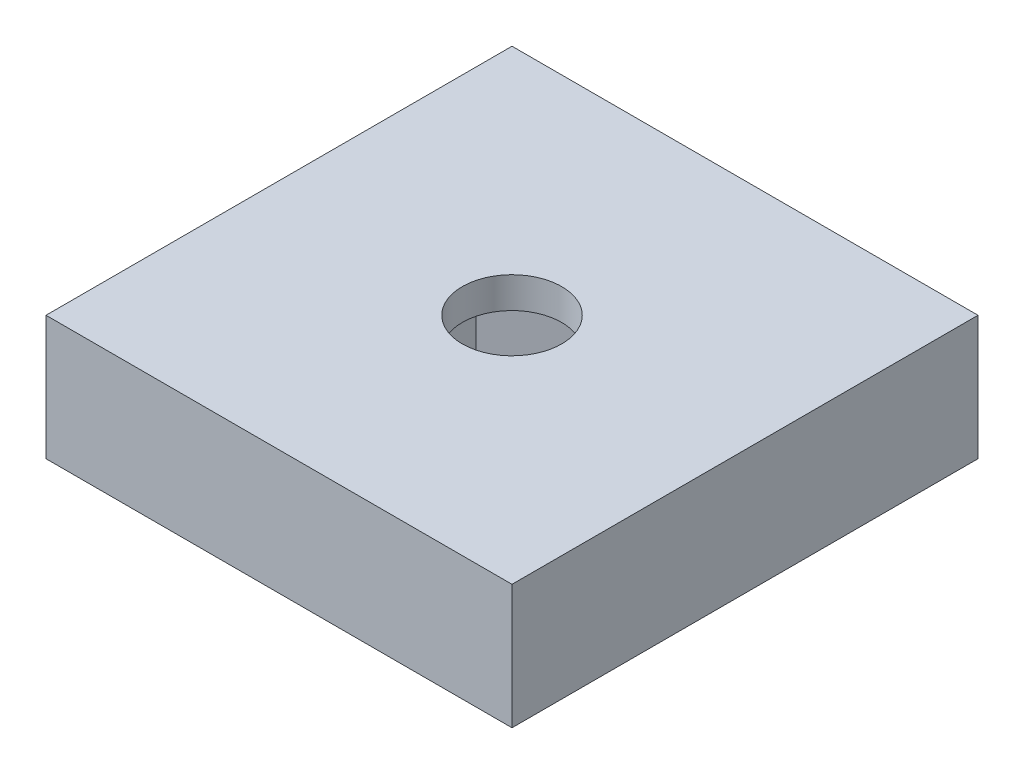
ISO-10303-21;
HEADER;
FILE_DESCRIPTION(('STEP AP214'),'2;1');
FILE_NAME('part.step','',(''),(''),'','','');
FILE_SCHEMA(('AUTOMOTIVE_DESIGN { 1 0 10303 214 1 1 1 1 }'));
ENDSEC;
DATA;
#1=APPLICATION_CONTEXT('core data for automotive mechanical design processes');
#2=APPLICATION_PROTOCOL_DEFINITION('international standard','automotive_design',2000,#1);
#3=PRODUCT_CONTEXT('',#1,'mechanical');
#4=PRODUCT('Part','Part','',(#3));
#5=PRODUCT_RELATED_PRODUCT_CATEGORY('part','',(#4));
#6=PRODUCT_DEFINITION_FORMATION('','',#4);
#7=PRODUCT_DEFINITION_CONTEXT('part definition',#1,'design');
#8=PRODUCT_DEFINITION('design','',#6,#7);
#9=PRODUCT_DEFINITION_SHAPE('','',#8);
#10=(LENGTH_UNIT() NAMED_UNIT(*) SI_UNIT(.MILLI.,.METRE.));
#11=(NAMED_UNIT(*) PLANE_ANGLE_UNIT() SI_UNIT($,.RADIAN.));
#12=(NAMED_UNIT(*) SI_UNIT($,.STERADIAN.) SOLID_ANGLE_UNIT());
#13=UNCERTAINTY_MEASURE_WITH_UNIT(LENGTH_MEASURE(1.E-05),#10,'distance_accuracy_value','');
#14=(GEOMETRIC_REPRESENTATION_CONTEXT(3) GLOBAL_UNCERTAINTY_ASSIGNED_CONTEXT((#13)) GLOBAL_UNIT_ASSIGNED_CONTEXT((#10,
#11,#12)) REPRESENTATION_CONTEXT('',''));
#15=CARTESIAN_POINT('',(0.,0.,0.));
#16=DIRECTION('',(0.,0.,1.));
#17=DIRECTION('',(1.,0.,0.));
#18=AXIS2_PLACEMENT_3D('',#15,#16,#17);
#19=CARTESIAN_POINT('',(7.5,3.,-7.5));
#20=DIRECTION('',(0.,-1.,0.));
#21=DIRECTION('',(0.,0.,-1.));
#22=AXIS2_PLACEMENT_3D('',#19,#20,#21);
#23=CYLINDRICAL_SURFACE('',#22,1.6);
#24=CARTESIAN_POINT('',(7.5,0.,-7.5));
#25=DIRECTION('',(0.,1.,0.));
#26=DIRECTION('',(0.,0.,1.));
#27=AXIS2_PLACEMENT_3D('',#24,#25,#26);
#28=CIRCLE('',#27,1.6);
#29=CARTESIAN_POINT('',(7.5,0.,-5.9));
#30=VERTEX_POINT('',#29);
#31=EDGE_CURVE('E194',#30,#30,#28,.T.);
#32=ORIENTED_EDGE('',*,*,#31,.F.);
#33=EDGE_LOOP('',(#32));
#34=FACE_BOUND('',#33,.T.);
#35=CARTESIAN_POINT('',(7.5,0.7,-7.5));
#36=DIRECTION('',(0.,1.,0.));
#37=DIRECTION('',(0.,0.,1.));
#38=AXIS2_PLACEMENT_3D('',#35,#36,#37);
#39=CIRCLE('',#38,1.6);
#40=CARTESIAN_POINT('',(7.5,0.7,-5.9));
#41=VERTEX_POINT('',#40);
#42=EDGE_CURVE('E36',#41,#41,#39,.T.);
#43=ORIENTED_EDGE('',*,*,#42,.T.);
#44=EDGE_LOOP('',(#43));
#45=FACE_BOUND('',#44,.T.);
#46=ADVANCED_FACE('F32',(#34,#45),#23,.F.);
#47=CARTESIAN_POINT('',(0.,0.,0.));
#48=DIRECTION('',(0.,-1.,0.));
#49=DIRECTION('',(0.,0.,-1.));
#50=AXIS2_PLACEMENT_3D('',#47,#48,#49);
#51=PLANE('',#50);
#52=DIRECTION('',(0.,0.,1.));
#53=VECTOR('',#52,1.);
#54=CARTESIAN_POINT('',(0.,0.,0.));
#55=LINE('',#54,#53);
#56=CARTESIAN_POINT('',(0.,0.,-15.));
#57=VERTEX_POINT('',#56);
#58=CARTESIAN_POINT('',(0.,0.,0.));
#59=VERTEX_POINT('',#58);
#60=EDGE_CURVE('E197',#57,#59,#55,.T.);
#61=ORIENTED_EDGE('',*,*,#60,.F.);
#62=DIRECTION('',(-1.,0.,0.));
#63=VECTOR('',#62,1.);
#64=CARTESIAN_POINT('',(0.,0.,-15.));
#65=LINE('',#64,#63);
#66=CARTESIAN_POINT('',(15.,0.,-15.));
#67=VERTEX_POINT('',#66);
#68=EDGE_CURVE('E48',#67,#57,#65,.T.);
#69=ORIENTED_EDGE('',*,*,#68,.F.);
#70=DIRECTION('',(0.,0.,-1.));
#71=VECTOR('',#70,1.);
#72=CARTESIAN_POINT('',(15.,0.,0.));
#73=LINE('',#72,#71);
#74=CARTESIAN_POINT('',(15.,0.,0.));
#75=VERTEX_POINT('',#74);
#76=EDGE_CURVE('E56',#75,#67,#73,.T.);
#77=ORIENTED_EDGE('',*,*,#76,.F.);
#78=DIRECTION('',(1.,0.,0.));
#79=VECTOR('',#78,1.);
#80=CARTESIAN_POINT('',(0.,0.,0.));
#81=LINE('',#80,#79);
#82=EDGE_CURVE('E199',#59,#75,#81,.T.);
#83=ORIENTED_EDGE('',*,*,#82,.F.);
#84=EDGE_LOOP('',(#61,#69,#77,#83));
#85=FACE_BOUND('',#84,.T.);
#86=ORIENTED_EDGE('',*,*,#31,.T.);
#87=EDGE_LOOP('',(#86));
#88=FACE_BOUND('',#87,.T.);
#89=ADVANCED_FACE('F207',(#85,#88),#51,.T.);
#90=CARTESIAN_POINT('',(0.,3.,0.));
#91=DIRECTION('',(1.,0.,0.));
#92=DIRECTION('',(0.,0.,-1.));
#93=AXIS2_PLACEMENT_3D('',#90,#91,#92);
#94=PLANE('',#93);
#95=ORIENTED_EDGE('',*,*,#60,.T.);
#96=DIRECTION('',(0.,-1.,0.));
#97=VECTOR('',#96,1.);
#98=CARTESIAN_POINT('',(0.,3.,0.));
#99=LINE('',#98,#97);
#100=CARTESIAN_POINT('',(0.,4.,0.));
#101=VERTEX_POINT('',#100);
#102=EDGE_CURVE('E11',#101,#59,#99,.T.);
#103=ORIENTED_EDGE('',*,*,#102,.F.);
#104=DIRECTION('',(0.,0.,1.));
#105=VECTOR('',#104,1.);
#106=CARTESIAN_POINT('',(0.,4.,-15.));
#107=LINE('',#106,#105);
#108=CARTESIAN_POINT('',(0.,4.,-15.));
#109=VERTEX_POINT('',#108);
#110=EDGE_CURVE('E120',#109,#101,#107,.T.);
#111=ORIENTED_EDGE('',*,*,#110,.F.);
#112=DIRECTION('',(0.,-1.,0.));
#113=VECTOR('',#112,1.);
#114=CARTESIAN_POINT('',(0.,3.,-15.));
#115=LINE('',#114,#113);
#116=EDGE_CURVE('E109',#109,#57,#115,.T.);
#117=ORIENTED_EDGE('',*,*,#116,.T.);
#118=EDGE_LOOP('',(#95,#103,#111,#117));
#119=FACE_BOUND('',#118,.T.);
#120=ADVANCED_FACE('F34',(#119),#94,.F.);
#121=CARTESIAN_POINT('',(0.,3.,0.));
#122=DIRECTION('',(0.,0.,-1.));
#123=DIRECTION('',(-1.,0.,0.));
#124=AXIS2_PLACEMENT_3D('',#121,#122,#123);
#125=PLANE('',#124);
#126=ORIENTED_EDGE('',*,*,#82,.T.);
#127=DIRECTION('',(0.,-1.,0.));
#128=VECTOR('',#127,1.);
#129=CARTESIAN_POINT('',(15.,3.,0.));
#130=LINE('',#129,#128);
#131=CARTESIAN_POINT('',(15.,4.,0.));
#132=VERTEX_POINT('',#131);
#133=EDGE_CURVE('E41',#132,#75,#130,.T.);
#134=ORIENTED_EDGE('',*,*,#133,.F.);
#135=DIRECTION('',(1.,0.,0.));
#136=VECTOR('',#135,1.);
#137=CARTESIAN_POINT('',(0.,4.,0.));
#138=LINE('',#137,#136);
#139=EDGE_CURVE('E124',#101,#132,#138,.T.);
#140=ORIENTED_EDGE('',*,*,#139,.F.);
#141=ORIENTED_EDGE('',*,*,#102,.T.);
#142=EDGE_LOOP('',(#126,#134,#140,#141));
#143=FACE_BOUND('',#142,.T.);
#144=ADVANCED_FACE('F209',(#143),#125,.F.);
#145=CARTESIAN_POINT('',(15.,3.,0.));
#146=DIRECTION('',(-1.,0.,0.));
#147=DIRECTION('',(0.,0.,1.));
#148=AXIS2_PLACEMENT_3D('',#145,#146,#147);
#149=PLANE('',#148);
#150=ORIENTED_EDGE('',*,*,#76,.T.);
#151=DIRECTION('',(0.,-1.,0.));
#152=VECTOR('',#151,1.);
#153=CARTESIAN_POINT('',(15.,3.,-15.));
#154=LINE('',#153,#152);
#155=CARTESIAN_POINT('',(15.,4.,-15.));
#156=VERTEX_POINT('',#155);
#157=EDGE_CURVE('E117',#156,#67,#154,.T.);
#158=ORIENTED_EDGE('',*,*,#157,.F.);
#159=DIRECTION('',(0.,0.,-1.));
#160=VECTOR('',#159,1.);
#161=CARTESIAN_POINT('',(15.,4.,0.));
#162=LINE('',#161,#160);
#163=EDGE_CURVE('E130',#132,#156,#162,.T.);
#164=ORIENTED_EDGE('',*,*,#163,.F.);
#165=ORIENTED_EDGE('',*,*,#133,.T.);
#166=EDGE_LOOP('',(#150,#158,#164,#165));
#167=FACE_BOUND('',#166,.T.);
#168=ADVANCED_FACE('F204',(#167),#149,.F.);
#169=CARTESIAN_POINT('',(0.,3.,-15.));
#170=DIRECTION('',(0.,0.,1.));
#171=DIRECTION('',(1.,0.,0.));
#172=AXIS2_PLACEMENT_3D('',#169,#170,#171);
#173=PLANE('',#172);
#174=ORIENTED_EDGE('',*,*,#68,.T.);
#175=ORIENTED_EDGE('',*,*,#116,.F.);
#176=DIRECTION('',(-1.,0.,0.));
#177=VECTOR('',#176,1.);
#178=CARTESIAN_POINT('',(15.,4.,-15.));
#179=LINE('',#178,#177);
#180=EDGE_CURVE('E113',#156,#109,#179,.T.);
#181=ORIENTED_EDGE('',*,*,#180,.F.);
#182=ORIENTED_EDGE('',*,*,#157,.T.);
#183=EDGE_LOOP('',(#174,#175,#181,#182));
#184=FACE_BOUND('',#183,.T.);
#185=ADVANCED_FACE('F111',(#184),#173,.F.);
#186=CARTESIAN_POINT('',(4.75,0.7,-5.91228675972853));
#187=DIRECTION('',(-0.5,0.,0.866025403784438));
#188=DIRECTION('',(0.866025403784438,0.,0.500000000000001));
#189=AXIS2_PLACEMENT_3D('',#186,#187,#188);
#190=PLANE('',#189);
#191=DIRECTION('',(0.866025403784438,0.,0.500000000000001));
#192=VECTOR('',#191,1.);
#193=CARTESIAN_POINT('',(4.75,3.,-5.91228675972853));
#194=LINE('',#193,#192);
#195=CARTESIAN_POINT('',(4.75,3.,-5.91228675972853));
#196=VERTEX_POINT('',#195);
#197=CARTESIAN_POINT('',(7.5,3.,-4.32457351945706));
#198=VERTEX_POINT('',#197);
#199=EDGE_CURVE('E140',#196,#198,#194,.T.);
#200=ORIENTED_EDGE('',*,*,#199,.T.);
#201=DIRECTION('',(0.,1.,0.));
#202=VECTOR('',#201,1.);
#203=CARTESIAN_POINT('',(7.5,0.7,-4.32457351945706));
#204=LINE('',#203,#202);
#205=CARTESIAN_POINT('',(7.5,0.7,-4.32457351945706));
#206=VERTEX_POINT('',#205);
#207=EDGE_CURVE('E160',#206,#198,#204,.T.);
#208=ORIENTED_EDGE('',*,*,#207,.F.);
#209=DIRECTION('',(0.866025403784438,0.,0.500000000000001));
#210=VECTOR('',#209,1.);
#211=CARTESIAN_POINT('',(4.75,0.7,-5.91228675972853));
#212=LINE('',#211,#210);
#213=CARTESIAN_POINT('',(4.75,0.7,-5.91228675972853));
#214=VERTEX_POINT('',#213);
#215=EDGE_CURVE('E141',#214,#206,#212,.T.);
#216=ORIENTED_EDGE('',*,*,#215,.F.);
#217=DIRECTION('',(0.,1.,0.));
#218=VECTOR('',#217,1.);
#219=CARTESIAN_POINT('',(4.75,0.7,-5.91228675972853));
#220=LINE('',#219,#218);
#221=EDGE_CURVE('E177',#214,#196,#220,.T.);
#222=ORIENTED_EDGE('',*,*,#221,.T.);
#223=EDGE_LOOP('',(#200,#208,#216,#222));
#224=FACE_BOUND('',#223,.T.);
#225=ADVANCED_FACE('F226',(#224),#190,.F.);
#226=CARTESIAN_POINT('',(4.75,0.7,-9.08771324027147));
#227=DIRECTION('',(-1.,0.,0.));
#228=DIRECTION('',(0.,0.,1.));
#229=AXIS2_PLACEMENT_3D('',#226,#227,#228);
#230=PLANE('',#229);
#231=DIRECTION('',(0.,0.,1.));
#232=VECTOR('',#231,1.);
#233=CARTESIAN_POINT('',(4.75,3.,-9.08771324027147));
#234=LINE('',#233,#232);
#235=CARTESIAN_POINT('',(4.75,3.,-9.08771324027147));
#236=VERTEX_POINT('',#235);
#237=EDGE_CURVE('E145',#236,#196,#234,.T.);
#238=ORIENTED_EDGE('',*,*,#237,.T.);
#239=ORIENTED_EDGE('',*,*,#221,.F.);
#240=DIRECTION('',(0.,0.,1.));
#241=VECTOR('',#240,1.);
#242=CARTESIAN_POINT('',(4.75,0.7,-9.08771324027147));
#243=LINE('',#242,#241);
#244=CARTESIAN_POINT('',(4.75,0.7,-9.08771324027147));
#245=VERTEX_POINT('',#244);
#246=EDGE_CURVE('E157',#245,#214,#243,.T.);
#247=ORIENTED_EDGE('',*,*,#246,.F.);
#248=DIRECTION('',(0.,1.,0.));
#249=VECTOR('',#248,1.);
#250=CARTESIAN_POINT('',(4.75,0.7,-9.08771324027147));
#251=LINE('',#250,#249);
#252=EDGE_CURVE('E180',#245,#236,#251,.T.);
#253=ORIENTED_EDGE('',*,*,#252,.T.);
#254=EDGE_LOOP('',(#238,#239,#247,#253));
#255=FACE_BOUND('',#254,.T.);
#256=ADVANCED_FACE('F233',(#255),#230,.F.);
#257=CARTESIAN_POINT('',(7.5,0.7,-10.6754264805429));
#258=DIRECTION('',(-0.499999999999999,0.,-0.866025403784439));
#259=DIRECTION('',(-0.866025403784439,0.,0.499999999999999));
#260=AXIS2_PLACEMENT_3D('',#257,#258,#259);
#261=PLANE('',#260);
#262=DIRECTION('',(-0.866025403784439,0.,0.499999999999999));
#263=VECTOR('',#262,1.);
#264=CARTESIAN_POINT('',(7.5,3.,-10.6754264805429));
#265=LINE('',#264,#263);
#266=CARTESIAN_POINT('',(7.5,3.,-10.6754264805429));
#267=VERTEX_POINT('',#266);
#268=EDGE_CURVE('E172',#267,#236,#265,.T.);
#269=ORIENTED_EDGE('',*,*,#268,.T.);
#270=ORIENTED_EDGE('',*,*,#252,.F.);
#271=DIRECTION('',(-0.866025403784439,0.,0.499999999999999));
#272=VECTOR('',#271,1.);
#273=CARTESIAN_POINT('',(7.5,0.7,-10.6754264805429));
#274=LINE('',#273,#272);
#275=CARTESIAN_POINT('',(7.5,0.7,-10.6754264805429));
#276=VERTEX_POINT('',#275);
#277=EDGE_CURVE('E154',#276,#245,#274,.T.);
#278=ORIENTED_EDGE('',*,*,#277,.F.);
#279=DIRECTION('',(0.,1.,0.));
#280=VECTOR('',#279,1.);
#281=CARTESIAN_POINT('',(7.5,0.7,-10.6754264805429));
#282=LINE('',#281,#280);
#283=EDGE_CURVE('E183',#276,#267,#282,.T.);
#284=ORIENTED_EDGE('',*,*,#283,.T.);
#285=EDGE_LOOP('',(#269,#270,#278,#284));
#286=FACE_BOUND('',#285,.T.);
#287=ADVANCED_FACE('F238',(#286),#261,.F.);
#288=CARTESIAN_POINT('',(10.25,0.7,-9.08771324027147));
#289=DIRECTION('',(0.5,0.,-0.866025403784439));
#290=DIRECTION('',(-0.866025403784439,0.,-0.5));
#291=AXIS2_PLACEMENT_3D('',#288,#289,#290);
#292=PLANE('',#291);
#293=DIRECTION('',(-0.866025403784439,0.,-0.5));
#294=VECTOR('',#293,1.);
#295=CARTESIAN_POINT('',(10.25,3.,-9.08771324027147));
#296=LINE('',#295,#294);
#297=CARTESIAN_POINT('',(10.25,3.,-9.08771324027147));
#298=VERTEX_POINT('',#297);
#299=EDGE_CURVE('E169',#298,#267,#296,.T.);
#300=ORIENTED_EDGE('',*,*,#299,.T.);
#301=ORIENTED_EDGE('',*,*,#283,.F.);
#302=DIRECTION('',(-0.866025403784439,0.,-0.5));
#303=VECTOR('',#302,1.);
#304=CARTESIAN_POINT('',(10.25,0.7,-9.08771324027147));
#305=LINE('',#304,#303);
#306=CARTESIAN_POINT('',(10.25,0.7,-9.08771324027147));
#307=VERTEX_POINT('',#306);
#308=EDGE_CURVE('E151',#307,#276,#305,.T.);
#309=ORIENTED_EDGE('',*,*,#308,.F.);
#310=DIRECTION('',(0.,1.,0.));
#311=VECTOR('',#310,1.);
#312=CARTESIAN_POINT('',(10.25,0.7,-9.08771324027147));
#313=LINE('',#312,#311);
#314=EDGE_CURVE('E186',#307,#298,#313,.T.);
#315=ORIENTED_EDGE('',*,*,#314,.T.);
#316=EDGE_LOOP('',(#300,#301,#309,#315));
#317=FACE_BOUND('',#316,.T.);
#318=ADVANCED_FACE('F256',(#317),#292,.F.);
#319=CARTESIAN_POINT('',(10.25,0.7,-5.91228675972853));
#320=DIRECTION('',(1.,0.,0.));
#321=DIRECTION('',(0.,0.,-1.));
#322=AXIS2_PLACEMENT_3D('',#319,#320,#321);
#323=PLANE('',#322);
#324=DIRECTION('',(0.,0.,-1.));
#325=VECTOR('',#324,1.);
#326=CARTESIAN_POINT('',(10.25,3.,-5.91228675972853));
#327=LINE('',#326,#325);
#328=CARTESIAN_POINT('',(10.25,3.,-5.91228675972853));
#329=VERTEX_POINT('',#328);
#330=EDGE_CURVE('E166',#329,#298,#327,.T.);
#331=ORIENTED_EDGE('',*,*,#330,.T.);
#332=ORIENTED_EDGE('',*,*,#314,.F.);
#333=DIRECTION('',(0.,0.,-1.));
#334=VECTOR('',#333,1.);
#335=CARTESIAN_POINT('',(10.25,0.7,-5.91228675972853));
#336=LINE('',#335,#334);
#337=CARTESIAN_POINT('',(10.25,0.7,-5.91228675972853));
#338=VERTEX_POINT('',#337);
#339=EDGE_CURVE('E148',#338,#307,#336,.T.);
#340=ORIENTED_EDGE('',*,*,#339,.F.);
#341=DIRECTION('',(0.,1.,0.));
#342=VECTOR('',#341,1.);
#343=CARTESIAN_POINT('',(10.25,0.7,-5.91228675972853));
#344=LINE('',#343,#342);
#345=EDGE_CURVE('E189',#338,#329,#344,.T.);
#346=ORIENTED_EDGE('',*,*,#345,.T.);
#347=EDGE_LOOP('',(#331,#332,#340,#346));
#348=FACE_BOUND('',#347,.T.);
#349=ADVANCED_FACE('F258',(#348),#323,.F.);
#350=CARTESIAN_POINT('',(7.5,0.7,-4.32457351945706));
#351=DIRECTION('',(0.5,0.,0.866025403784439));
#352=DIRECTION('',(0.866025403784439,0.,-0.5));
#353=AXIS2_PLACEMENT_3D('',#350,#351,#352);
#354=PLANE('',#353);
#355=DIRECTION('',(0.866025403784439,0.,-0.5));
#356=VECTOR('',#355,1.);
#357=CARTESIAN_POINT('',(7.5,3.,-4.32457351945706));
#358=LINE('',#357,#356);
#359=EDGE_CURVE('E163',#198,#329,#358,.T.);
#360=ORIENTED_EDGE('',*,*,#359,.T.);
#361=ORIENTED_EDGE('',*,*,#345,.F.);
#362=DIRECTION('',(0.866025403784439,0.,-0.5));
#363=VECTOR('',#362,1.);
#364=CARTESIAN_POINT('',(7.5,0.7,-4.32457351945706));
#365=LINE('',#364,#363);
#366=EDGE_CURVE('E144',#206,#338,#365,.T.);
#367=ORIENTED_EDGE('',*,*,#366,.F.);
#368=ORIENTED_EDGE('',*,*,#207,.T.);
#369=EDGE_LOOP('',(#360,#361,#367,#368));
#370=FACE_BOUND('',#369,.T.);
#371=ADVANCED_FACE('F245',(#370),#354,.F.);
#372=CARTESIAN_POINT('',(0.,0.7,0.));
#373=DIRECTION('',(0.,1.,0.));
#374=DIRECTION('',(0.,0.,1.));
#375=AXIS2_PLACEMENT_3D('',#372,#373,#374);
#376=PLANE('',#375);
#377=ORIENTED_EDGE('',*,*,#42,.F.);
#378=EDGE_LOOP('',(#377));
#379=FACE_BOUND('',#378,.T.);
#380=ORIENTED_EDGE('',*,*,#215,.T.);
#381=ORIENTED_EDGE('',*,*,#366,.T.);
#382=ORIENTED_EDGE('',*,*,#339,.T.);
#383=ORIENTED_EDGE('',*,*,#308,.T.);
#384=ORIENTED_EDGE('',*,*,#277,.T.);
#385=ORIENTED_EDGE('',*,*,#246,.T.);
#386=EDGE_LOOP('',(#380,#381,#382,#383,#384,#385));
#387=FACE_BOUND('',#386,.T.);
#388=ADVANCED_FACE('F248',(#379,#387),#376,.T.);
#389=CARTESIAN_POINT('',(0.,4.,0.));
#390=DIRECTION('',(0.,1.,0.));
#391=DIRECTION('',(0.,0.,1.));
#392=AXIS2_PLACEMENT_3D('',#389,#390,#391);
#393=PLANE('',#392);
#394=ORIENTED_EDGE('',*,*,#180,.T.);
#395=ORIENTED_EDGE('',*,*,#110,.T.);
#396=ORIENTED_EDGE('',*,*,#139,.T.);
#397=ORIENTED_EDGE('',*,*,#163,.T.);
#398=EDGE_LOOP('',(#394,#395,#396,#397));
#399=FACE_BOUND('',#398,.T.);
#400=CARTESIAN_POINT('',(7.5,4.,-7.5));
#401=DIRECTION('',(0.,1.,0.));
#402=DIRECTION('',(0.,0.,1.));
#403=AXIS2_PLACEMENT_3D('',#400,#401,#402);
#404=CIRCLE('',#403,1.6);
#405=CARTESIAN_POINT('',(7.5,4.,-5.9));
#406=VERTEX_POINT('',#405);
#407=EDGE_CURVE('E131',#406,#406,#404,.T.);
#408=ORIENTED_EDGE('',*,*,#407,.F.);
#409=EDGE_LOOP('',(#408));
#410=FACE_BOUND('',#409,.T.);
#411=ADVANCED_FACE('F127',(#399,#410),#393,.T.);
#412=CARTESIAN_POINT('',(0.,3.,0.));
#413=DIRECTION('',(0.,1.,0.));
#414=DIRECTION('',(0.,0.,1.));
#415=AXIS2_PLACEMENT_3D('',#412,#413,#414);
#416=PLANE('',#415);
#417=ORIENTED_EDGE('',*,*,#359,.F.);
#418=ORIENTED_EDGE('',*,*,#199,.F.);
#419=ORIENTED_EDGE('',*,*,#237,.F.);
#420=ORIENTED_EDGE('',*,*,#268,.F.);
#421=ORIENTED_EDGE('',*,*,#299,.F.);
#422=ORIENTED_EDGE('',*,*,#330,.F.);
#423=EDGE_LOOP('',(#417,#418,#419,#420,#421,#422));
#424=FACE_BOUND('',#423,.T.);
#425=CARTESIAN_POINT('',(7.5,3.,-7.5));
#426=DIRECTION('',(0.,1.,0.));
#427=DIRECTION('',(0.,0.,1.));
#428=AXIS2_PLACEMENT_3D('',#425,#426,#427);
#429=CIRCLE('',#428,1.6);
#430=CARTESIAN_POINT('',(7.5,3.,-5.9));
#431=VERTEX_POINT('',#430);
#432=EDGE_CURVE('E134',#431,#431,#429,.T.);
#433=ORIENTED_EDGE('',*,*,#432,.T.);
#434=EDGE_LOOP('',(#433));
#435=FACE_BOUND('',#434,.T.);
#436=ADVANCED_FACE('F251',(#424,#435),#416,.F.);
#437=CARTESIAN_POINT('',(7.5,4.,-7.5));
#438=DIRECTION('',(0.,-1.,0.));
#439=DIRECTION('',(0.,0.,-1.));
#440=AXIS2_PLACEMENT_3D('',#437,#438,#439);
#441=CYLINDRICAL_SURFACE('',#440,1.6);
#442=ORIENTED_EDGE('',*,*,#407,.T.);
#443=EDGE_LOOP('',(#442));
#444=FACE_BOUND('',#443,.T.);
#445=ORIENTED_EDGE('',*,*,#432,.F.);
#446=EDGE_LOOP('',(#445));
#447=FACE_BOUND('',#446,.T.);
#448=ADVANCED_FACE('F274',(#444,#447),#441,.F.);
#449=CLOSED_SHELL('',(#46,#89,#120,#144,#168,#185,#225,#256,#287,#318,#349,#371,#388,#411,#436,#448));
#450=MANIFOLD_SOLID_BREP('B2',#449);
#451=ADVANCED_BREP_SHAPE_REPRESENTATION('',(#18,#450),#14);
#452=SHAPE_DEFINITION_REPRESENTATION(#9,#451);
ENDSEC;
END-ISO-10303-21;
